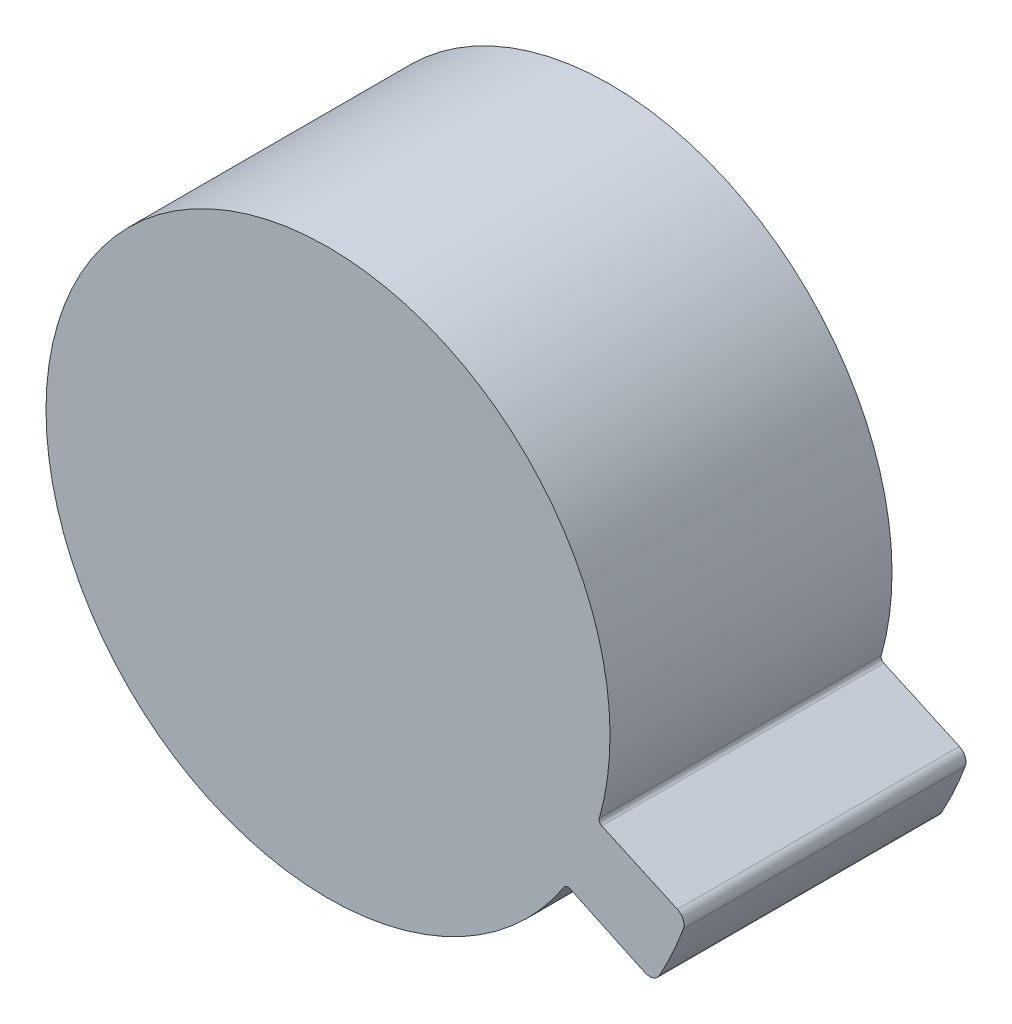
ISO-10303-21;
HEADER;
FILE_DESCRIPTION(('STEP AP214'),'2;1');
FILE_NAME('part.step','',(''),(''),'','','');
FILE_SCHEMA(('AUTOMOTIVE_DESIGN { 1 0 10303 214 1 1 1 1 }'));
ENDSEC;
DATA;
#1=APPLICATION_CONTEXT('core data for automotive mechanical design processes');
#2=APPLICATION_PROTOCOL_DEFINITION('international standard','automotive_design',2000,#1);
#3=PRODUCT_CONTEXT('',#1,'mechanical');
#4=PRODUCT('Part','Part','',(#3));
#5=PRODUCT_RELATED_PRODUCT_CATEGORY('part','',(#4));
#6=PRODUCT_DEFINITION_FORMATION('','',#4);
#7=PRODUCT_DEFINITION_CONTEXT('part definition',#1,'design');
#8=PRODUCT_DEFINITION('design','',#6,#7);
#9=PRODUCT_DEFINITION_SHAPE('','',#8);
#10=(LENGTH_UNIT() NAMED_UNIT(*) SI_UNIT(.MILLI.,.METRE.));
#11=(NAMED_UNIT(*) PLANE_ANGLE_UNIT() SI_UNIT($,.RADIAN.));
#12=(NAMED_UNIT(*) SI_UNIT($,.STERADIAN.) SOLID_ANGLE_UNIT());
#13=UNCERTAINTY_MEASURE_WITH_UNIT(LENGTH_MEASURE(1.E-05),#10,'distance_accuracy_value','');
#14=(GEOMETRIC_REPRESENTATION_CONTEXT(3) GLOBAL_UNCERTAINTY_ASSIGNED_CONTEXT((#13)) GLOBAL_UNIT_ASSIGNED_CONTEXT((#10,
#11,#12)) REPRESENTATION_CONTEXT('',''));
#15=CARTESIAN_POINT('',(0.,0.,0.));
#16=DIRECTION('',(0.,0.,1.));
#17=DIRECTION('',(1.,0.,0.));
#18=AXIS2_PLACEMENT_3D('',#15,#16,#17);
#19=CARTESIAN_POINT('',(15.2779729773756,-5.63171072795015,12.5));
#20=DIRECTION('',(0.,0.,-1.));
#21=DIRECTION('',(-1.,0.,0.));
#22=AXIS2_PLACEMENT_3D('',#19,#20,#21);
#23=CYLINDRICAL_SURFACE('',#22,0.499999999999998);
#24=CARTESIAN_POINT('',(15.2779729773756,-5.63171072795015,0.));
#25=DIRECTION('',(0.,0.,1.));
#26=DIRECTION('',(1.,0.,0.));
#27=AXIS2_PLACEMENT_3D('',#24,#25,#26);
#28=CIRCLE('',#27,0.499999999999998);
#29=CARTESIAN_POINT('',(15.747114806579,-5.80464407953859,0.));
#30=VERTEX_POINT('',#29);
#31=CARTESIAN_POINT('',(15.4851855949086,-5.17666904729318,0.));
#32=VERTEX_POINT('',#31);
#33=EDGE_CURVE('E129',#30,#32,#28,.T.);
#34=ORIENTED_EDGE('',*,*,#33,.T.);
#35=DIRECTION('',(0.,0.,-1.));
#36=VECTOR('',#35,1.);
#37=CARTESIAN_POINT('',(15.4851855949086,-5.17666904729318,12.5));
#38=LINE('',#37,#36);
#39=CARTESIAN_POINT('',(15.4851855949086,-5.17666904729318,12.5));
#40=VERTEX_POINT('',#39);
#41=EDGE_CURVE('E11',#40,#32,#38,.T.);
#42=ORIENTED_EDGE('',*,*,#41,.F.);
#43=CARTESIAN_POINT('',(15.2779729773756,-5.63171072795015,12.5));
#44=DIRECTION('',(0.,0.,1.));
#45=DIRECTION('',(1.,0.,0.));
#46=AXIS2_PLACEMENT_3D('',#43,#44,#45);
#47=CIRCLE('',#46,0.499999999999998);
#48=CARTESIAN_POINT('',(15.747114806579,-5.80464407953859,12.5));
#49=VERTEX_POINT('',#48);
#50=EDGE_CURVE('E143',#49,#40,#47,.T.);
#51=ORIENTED_EDGE('',*,*,#50,.F.);
#52=DIRECTION('',(0.,0.,-1.));
#53=VECTOR('',#52,1.);
#54=CARTESIAN_POINT('',(15.747114806579,-5.80464407953859,12.5));
#55=LINE('',#54,#53);
#56=EDGE_CURVE('E125',#49,#30,#55,.T.);
#57=ORIENTED_EDGE('',*,*,#56,.T.);
#58=EDGE_LOOP('',(#34,#42,#51,#57));
#59=FACE_BOUND('',#58,.T.);
#60=ADVANCED_FACE('F33',(#59),#23,.T.);
#61=CARTESIAN_POINT('',(15.4851855949086,-5.17666904729318,12.5));
#62=DIRECTION('',(-0.414425235066037,-0.910083361313929,0.));
#63=DIRECTION('',(0.910083361313929,-0.414425235066037,0.));
#64=AXIS2_PLACEMENT_3D('',#61,#62,#63);
#65=PLANE('',#64);
#66=DIRECTION('',(-0.91008336131393,0.414425235066037,0.));
#67=VECTOR('',#66,1.);
#68=CARTESIAN_POINT('',(15.4851855949086,-5.17666904729318,0.));
#69=LINE('',#68,#67);
#70=CARTESIAN_POINT('',(12.1342315429715,-3.65074298414162,0.));
#71=VERTEX_POINT('',#70);
#72=EDGE_CURVE('E132',#32,#71,#69,.T.);
#73=ORIENTED_EDGE('',*,*,#72,.T.);
#74=DIRECTION('',(0.,0.,-1.));
#75=VECTOR('',#74,1.);
#76=CARTESIAN_POINT('',(12.1342315429715,-3.65074298414162,12.5));
#77=LINE('',#76,#75);
#78=CARTESIAN_POINT('',(12.1342315429715,-3.65074298414162,12.5));
#79=VERTEX_POINT('',#78);
#80=EDGE_CURVE('E41',#79,#71,#77,.T.);
#81=ORIENTED_EDGE('',*,*,#80,.F.);
#82=DIRECTION('',(-0.91008336131393,0.414425235066037,0.));
#83=VECTOR('',#82,1.);
#84=CARTESIAN_POINT('',(15.4851855949086,-5.17666904729318,12.5));
#85=LINE('',#84,#83);
#86=EDGE_CURVE('E92',#40,#79,#85,.T.);
#87=ORIENTED_EDGE('',*,*,#86,.F.);
#88=ORIENTED_EDGE('',*,*,#41,.T.);
#89=EDGE_LOOP('',(#73,#81,#87,#88));
#90=FACE_BOUND('',#89,.T.);
#91=ADVANCED_FACE('F178',(#90),#65,.F.);
#92=CARTESIAN_POINT('',(12.2171165899847,-3.46872631187883,12.5));
#93=DIRECTION('',(0.,0.,-1.));
#94=DIRECTION('',(-1.,0.,0.));
#95=AXIS2_PLACEMENT_3D('',#92,#93,#94);
#96=CYLINDRICAL_SURFACE('',#95,0.200000000000001);
#97=CARTESIAN_POINT('',(12.2171165899847,-3.46872631187883,0.));
#98=DIRECTION('',(0.,0.,-1.));
#99=DIRECTION('',(-1.,0.,0.));
#100=AXIS2_PLACEMENT_3D('',#97,#98,#99);
#101=CIRCLE('',#100,0.200000000000001);
#102=CARTESIAN_POINT('',(12.0247210531345,-3.41410070066815,0.));
#103=VERTEX_POINT('',#102);
#104=EDGE_CURVE('E134',#71,#103,#101,.T.);
#105=ORIENTED_EDGE('',*,*,#104,.T.);
#106=DIRECTION('',(0.,0.,-1.));
#107=VECTOR('',#106,1.);
#108=CARTESIAN_POINT('',(12.0247210531345,-3.41410070066815,12.5));
#109=LINE('',#108,#107);
#110=CARTESIAN_POINT('',(12.0247210531345,-3.41410070066815,12.5));
#111=VERTEX_POINT('',#110);
#112=EDGE_CURVE('E150',#111,#103,#109,.T.);
#113=ORIENTED_EDGE('',*,*,#112,.F.);
#114=CARTESIAN_POINT('',(12.2171165899847,-3.46872631187883,12.5));
#115=DIRECTION('',(0.,0.,-1.));
#116=DIRECTION('',(-1.,0.,0.));
#117=AXIS2_PLACEMENT_3D('',#114,#115,#116);
#118=CIRCLE('',#117,0.200000000000001);
#119=EDGE_CURVE('E158',#79,#111,#118,.T.);
#120=ORIENTED_EDGE('',*,*,#119,.F.);
#121=ORIENTED_EDGE('',*,*,#80,.T.);
#122=EDGE_LOOP('',(#105,#113,#120,#121));
#123=FACE_BOUND('',#122,.T.);
#124=ADVANCED_FACE('F156',(#123),#96,.F.);
#125=CARTESIAN_POINT('',(0.,0.,12.5));
#126=DIRECTION('',(0.,0.,-1.));
#127=DIRECTION('',(-1.,0.,0.));
#128=AXIS2_PLACEMENT_3D('',#125,#126,#127);
#129=CYLINDRICAL_SURFACE('',#128,12.5);
#130=CARTESIAN_POINT('',(0.,0.,0.));
#131=DIRECTION('',(0.,0.,1.));
#132=DIRECTION('',(1.,0.,0.));
#133=AXIS2_PLACEMENT_3D('',#130,#131,#132);
#134=CIRCLE('',#133,12.5);
#135=CARTESIAN_POINT('',(10.4644302610838,-6.837082660822,0.));
#136=VERTEX_POINT('',#135);
#137=EDGE_CURVE('E136',#103,#136,#134,.T.);
#138=ORIENTED_EDGE('',*,*,#137,.T.);
#139=DIRECTION('',(0.,0.,-1.));
#140=VECTOR('',#139,1.);
#141=CARTESIAN_POINT('',(10.4644302610838,-6.837082660822,12.5));
#142=LINE('',#141,#140);
#143=CARTESIAN_POINT('',(10.4644302610838,-6.837082660822,12.5));
#144=VERTEX_POINT('',#143);
#145=EDGE_CURVE('E147',#144,#136,#142,.T.);
#146=ORIENTED_EDGE('',*,*,#145,.F.);
#147=CARTESIAN_POINT('',(0.,0.,12.5));
#148=DIRECTION('',(0.,0.,1.));
#149=DIRECTION('',(1.,0.,0.));
#150=AXIS2_PLACEMENT_3D('',#147,#148,#149);
#151=CIRCLE('',#150,12.5);
#152=EDGE_CURVE('E170',#111,#144,#151,.T.);
#153=ORIENTED_EDGE('',*,*,#152,.F.);
#154=ORIENTED_EDGE('',*,*,#112,.T.);
#155=EDGE_LOOP('',(#138,#146,#153,#154));
#156=FACE_BOUND('',#155,.T.);
#157=ADVANCED_FACE('F166',(#156),#129,.T.);
#158=CARTESIAN_POINT('',(10.6318611452612,-6.94647598339515,12.5));
#159=DIRECTION('',(0.,0.,-1.));
#160=DIRECTION('',(-1.,0.,0.));
#161=AXIS2_PLACEMENT_3D('',#158,#159,#160);
#162=CYLINDRICAL_SURFACE('',#161,0.2);
#163=CARTESIAN_POINT('',(10.6318611452612,-6.94647598339515,0.));
#164=DIRECTION('',(0.,0.,-1.));
#165=DIRECTION('',(1.,0.,0.));
#166=AXIS2_PLACEMENT_3D('',#163,#164,#165);
#167=CIRCLE('',#166,0.2);
#168=CARTESIAN_POINT('',(10.7168303378893,-6.76542285223159,0.));
#169=VERTEX_POINT('',#168);
#170=EDGE_CURVE('E138',#136,#169,#167,.T.);
#171=ORIENTED_EDGE('',*,*,#170,.T.);
#172=DIRECTION('',(0.,0.,-1.));
#173=VECTOR('',#172,1.);
#174=CARTESIAN_POINT('',(10.7168303378893,-6.76542285223159,12.5));
#175=LINE('',#174,#173);
#176=CARTESIAN_POINT('',(10.7168303378893,-6.76542285223159,12.5));
#177=VERTEX_POINT('',#176);
#178=EDGE_CURVE('E120',#177,#169,#175,.T.);
#179=ORIENTED_EDGE('',*,*,#178,.F.);
#180=CARTESIAN_POINT('',(10.6318611452612,-6.94647598339515,12.5));
#181=DIRECTION('',(0.,0.,-1.));
#182=DIRECTION('',(1.,0.,0.));
#183=AXIS2_PLACEMENT_3D('',#180,#181,#182);
#184=CIRCLE('',#183,0.2);
#185=EDGE_CURVE('E111',#144,#177,#184,.T.);
#186=ORIENTED_EDGE('',*,*,#185,.F.);
#187=ORIENTED_EDGE('',*,*,#145,.T.);
#188=EDGE_LOOP('',(#171,#179,#186,#187));
#189=FACE_BOUND('',#188,.T.);
#190=ADVANCED_FACE('F169',(#189),#162,.F.);
#191=CARTESIAN_POINT('',(14.04074762561,-8.32535482626113,12.5));
#192=DIRECTION('',(0.424845963140479,0.905265655817804,0.));
#193=DIRECTION('',(-0.905265655817804,0.424845963140479,0.));
#194=AXIS2_PLACEMENT_3D('',#191,#192,#193);
#195=PLANE('',#194);
#196=DIRECTION('',(0.905265655817804,-0.424845963140479,0.));
#197=VECTOR('',#196,1.);
#198=CARTESIAN_POINT('',(14.04074762561,-8.32535482626113,0.));
#199=LINE('',#198,#197);
#200=CARTESIAN_POINT('',(14.04074762561,-8.32535482626113,0.));
#201=VERTEX_POINT('',#200);
#202=EDGE_CURVE('E119',#169,#201,#199,.T.);
#203=ORIENTED_EDGE('',*,*,#202,.T.);
#204=DIRECTION('',(0.,0.,-1.));
#205=VECTOR('',#204,1.);
#206=CARTESIAN_POINT('',(14.04074762561,-8.32535482626113,12.5));
#207=LINE('',#206,#205);
#208=CARTESIAN_POINT('',(14.04074762561,-8.32535482626113,12.5));
#209=VERTEX_POINT('',#208);
#210=EDGE_CURVE('E116',#209,#201,#207,.T.);
#211=ORIENTED_EDGE('',*,*,#210,.F.);
#212=DIRECTION('',(0.905265655817804,-0.424845963140479,0.));
#213=VECTOR('',#212,1.);
#214=CARTESIAN_POINT('',(14.04074762561,-8.32535482626113,12.5));
#215=LINE('',#214,#213);
#216=EDGE_CURVE('E105',#177,#209,#215,.T.);
#217=ORIENTED_EDGE('',*,*,#216,.F.);
#218=ORIENTED_EDGE('',*,*,#178,.T.);
#219=EDGE_LOOP('',(#203,#211,#217,#218));
#220=FACE_BOUND('',#219,.T.);
#221=ADVANCED_FACE('F117',(#220),#195,.F.);
#222=CARTESIAN_POINT('',(14.2531706071803,-7.87272199835223,12.5));
#223=DIRECTION('',(0.,0.,-1.));
#224=DIRECTION('',(-1.,0.,0.));
#225=AXIS2_PLACEMENT_3D('',#222,#223,#224);
#226=CYLINDRICAL_SURFACE('',#225,0.499999999999995);
#227=CARTESIAN_POINT('',(14.2531706071803,-7.87272199835223,0.));
#228=DIRECTION('',(0.,0.,1.));
#229=DIRECTION('',(1.,0.,0.));
#230=AXIS2_PLACEMENT_3D('',#227,#228,#229);
#231=CIRCLE('',#230,0.499999999999995);
#232=CARTESIAN_POINT('',(14.6908437553462,-8.11447024627666,0.));
#233=VERTEX_POINT('',#232);
#234=EDGE_CURVE('E78',#201,#233,#231,.T.);
#235=ORIENTED_EDGE('',*,*,#234,.T.);
#236=DIRECTION('',(0.,0.,-1.));
#237=VECTOR('',#236,1.);
#238=CARTESIAN_POINT('',(14.6908437553462,-8.11447024627666,12.5));
#239=LINE('',#238,#237);
#240=CARTESIAN_POINT('',(14.6908437553462,-8.11447024627666,12.5));
#241=VERTEX_POINT('',#240);
#242=EDGE_CURVE('E121',#241,#233,#239,.T.);
#243=ORIENTED_EDGE('',*,*,#242,.F.);
#244=CARTESIAN_POINT('',(14.2531706071803,-7.87272199835223,12.5));
#245=DIRECTION('',(0.,0.,1.));
#246=DIRECTION('',(1.,0.,0.));
#247=AXIS2_PLACEMENT_3D('',#244,#245,#246);
#248=CIRCLE('',#247,0.499999999999995);
#249=EDGE_CURVE('E109',#209,#241,#248,.T.);
#250=ORIENTED_EDGE('',*,*,#249,.F.);
#251=ORIENTED_EDGE('',*,*,#210,.T.);
#252=EDGE_LOOP('',(#235,#243,#250,#251));
#253=FACE_BOUND('',#252,.T.);
#254=ADVANCED_FACE('F123',(#253),#226,.T.);
#255=CARTESIAN_POINT('',(0.,0.,12.5));
#256=DIRECTION('',(0.,0.,-1.));
#257=DIRECTION('',(-1.,0.,0.));
#258=AXIS2_PLACEMENT_3D('',#255,#256,#257);
#259=CYLINDRICAL_SURFACE('',#258,16.7828936009766);
#260=CARTESIAN_POINT('',(0.,0.,0.));
#261=DIRECTION('',(0.,0.,1.));
#262=DIRECTION('',(-1.,0.,0.));
#263=AXIS2_PLACEMENT_3D('',#260,#261,#262);
#264=CIRCLE('',#263,16.7828936009766);
#265=EDGE_CURVE('E84',#233,#30,#264,.T.);
#266=ORIENTED_EDGE('',*,*,#265,.T.);
#267=ORIENTED_EDGE('',*,*,#56,.F.);
#268=CARTESIAN_POINT('',(0.,0.,12.5));
#269=DIRECTION('',(0.,0.,1.));
#270=DIRECTION('',(-1.,0.,0.));
#271=AXIS2_PLACEMENT_3D('',#268,#269,#270);
#272=CIRCLE('',#271,16.7828936009766);
#273=EDGE_CURVE('E49',#241,#49,#272,.T.);
#274=ORIENTED_EDGE('',*,*,#273,.F.);
#275=ORIENTED_EDGE('',*,*,#242,.T.);
#276=EDGE_LOOP('',(#266,#267,#274,#275));
#277=FACE_BOUND('',#276,.T.);
#278=ADVANCED_FACE('F194',(#277),#259,.T.);
#279=CARTESIAN_POINT('',(15.2779729773756,-5.63171072795015,12.5));
#280=DIRECTION('',(0.,0.,1.));
#281=DIRECTION('',(1.,0.,0.));
#282=AXIS2_PLACEMENT_3D('',#279,#280,#281);
#283=PLANE('',#282);
#284=ORIENTED_EDGE('',*,*,#50,.T.);
#285=ORIENTED_EDGE('',*,*,#86,.T.);
#286=ORIENTED_EDGE('',*,*,#119,.T.);
#287=ORIENTED_EDGE('',*,*,#152,.T.);
#288=ORIENTED_EDGE('',*,*,#185,.T.);
#289=ORIENTED_EDGE('',*,*,#216,.T.);
#290=ORIENTED_EDGE('',*,*,#249,.T.);
#291=ORIENTED_EDGE('',*,*,#273,.T.);
#292=EDGE_LOOP('',(#284,#285,#286,#287,#288,#289,#290,#291));
#293=FACE_BOUND('',#292,.T.);
#294=ADVANCED_FACE('F107',(#293),#283,.T.);
#295=CARTESIAN_POINT('',(15.2779729773756,-5.63171072795015,0.));
#296=DIRECTION('',(0.,0.,1.));
#297=DIRECTION('',(1.,0.,0.));
#298=AXIS2_PLACEMENT_3D('',#295,#296,#297);
#299=PLANE('',#298);
#300=ORIENTED_EDGE('',*,*,#33,.F.);
#301=ORIENTED_EDGE('',*,*,#265,.F.);
#302=ORIENTED_EDGE('',*,*,#234,.F.);
#303=ORIENTED_EDGE('',*,*,#202,.F.);
#304=ORIENTED_EDGE('',*,*,#170,.F.);
#305=ORIENTED_EDGE('',*,*,#137,.F.);
#306=ORIENTED_EDGE('',*,*,#104,.F.);
#307=ORIENTED_EDGE('',*,*,#72,.F.);
#308=EDGE_LOOP('',(#300,#301,#302,#303,#304,#305,#306,#307));
#309=FACE_BOUND('',#308,.T.);
#310=ADVANCED_FACE('F162',(#309),#299,.F.);
#311=CLOSED_SHELL('',(#60,#91,#124,#157,#190,#221,#254,#278,#294,#310));
#312=MANIFOLD_SOLID_BREP('B2',#311);
#313=ADVANCED_BREP_SHAPE_REPRESENTATION('',(#18,#312),#14);
#314=SHAPE_DEFINITION_REPRESENTATION(#9,#313);
ENDSEC;
END-ISO-10303-21;
